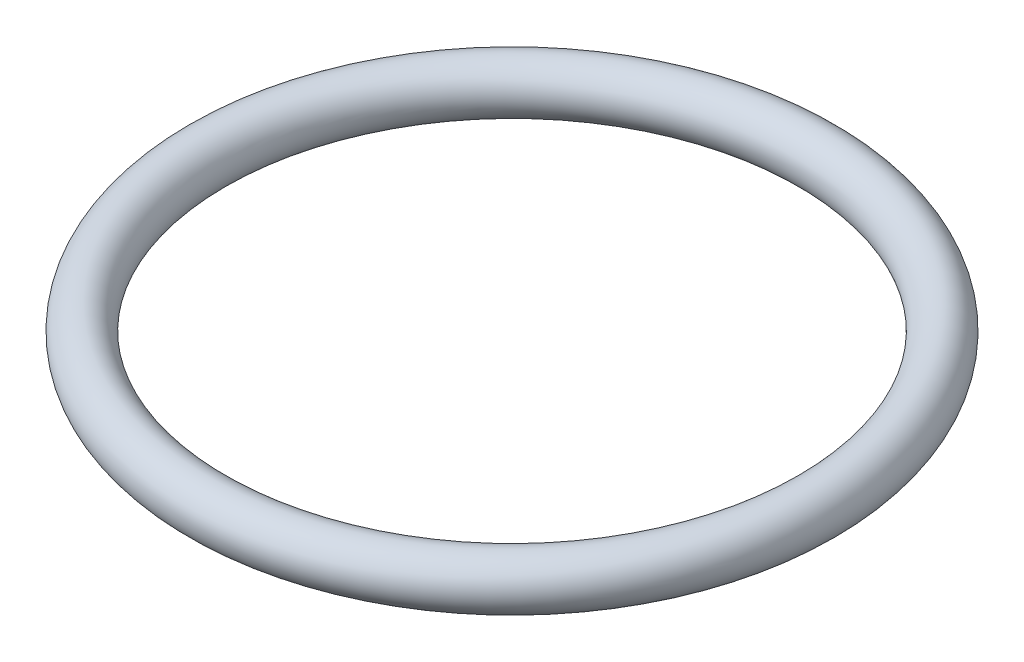
ISO-10303-21;
HEADER;
FILE_DESCRIPTION(('STEP AP214'),'2;1');
FILE_NAME('part.step','',(''),(''),'','','');
FILE_SCHEMA(('AUTOMOTIVE_DESIGN { 1 0 10303 214 1 1 1 1 }'));
ENDSEC;
DATA;
#1=APPLICATION_CONTEXT('core data for automotive mechanical design processes');
#2=APPLICATION_PROTOCOL_DEFINITION('international standard','automotive_design',2000,#1);
#3=PRODUCT_CONTEXT('',#1,'mechanical');
#4=PRODUCT('Part','Part','',(#3));
#5=PRODUCT_RELATED_PRODUCT_CATEGORY('part','',(#4));
#6=PRODUCT_DEFINITION_FORMATION('','',#4);
#7=PRODUCT_DEFINITION_CONTEXT('part definition',#1,'design');
#8=PRODUCT_DEFINITION('design','',#6,#7);
#9=PRODUCT_DEFINITION_SHAPE('','',#8);
#10=(LENGTH_UNIT() NAMED_UNIT(*) SI_UNIT(.MILLI.,.METRE.));
#11=(NAMED_UNIT(*) PLANE_ANGLE_UNIT() SI_UNIT($,.RADIAN.));
#12=(NAMED_UNIT(*) SI_UNIT($,.STERADIAN.) SOLID_ANGLE_UNIT());
#13=UNCERTAINTY_MEASURE_WITH_UNIT(LENGTH_MEASURE(1.E-05),#10,'distance_accuracy_value','');
#14=(GEOMETRIC_REPRESENTATION_CONTEXT(3) GLOBAL_UNCERTAINTY_ASSIGNED_CONTEXT((#13)) GLOBAL_UNIT_ASSIGNED_CONTEXT((#10,
#11,#12)) REPRESENTATION_CONTEXT('',''));
#15=CARTESIAN_POINT('',(0.,0.,0.));
#16=DIRECTION('',(0.,0.,1.));
#17=DIRECTION('',(1.,0.,0.));
#18=AXIS2_PLACEMENT_3D('',#15,#16,#17);
#19=CARTESIAN_POINT('',(0.,2.22044604925031E-13,0.));
#20=DIRECTION('',(0.,-1.,0.));
#21=DIRECTION('',(1.,0.,0.));
#22=AXIS2_PLACEMENT_3D('',#19,#20,#21);
#23=TOROIDAL_SURFACE('',#22,60.,5.);
#24=CARTESIAN_POINT('',(65.,4.48990891949835E-13,0.));
#25=VERTEX_POINT('',#24);
#26=VERTEX_LOOP('',#25);
#27=FACE_BOUND('',#26,.T.);
#28=ADVANCED_FACE('F40',(#27),#23,.T.);
#29=CLOSED_SHELL('',(#28));
#30=MANIFOLD_SOLID_BREP('B2',#29);
#31=ADVANCED_BREP_SHAPE_REPRESENTATION('',(#18,#30),#14);
#32=SHAPE_DEFINITION_REPRESENTATION(#9,#31);
ENDSEC;
END-ISO-10303-21;
